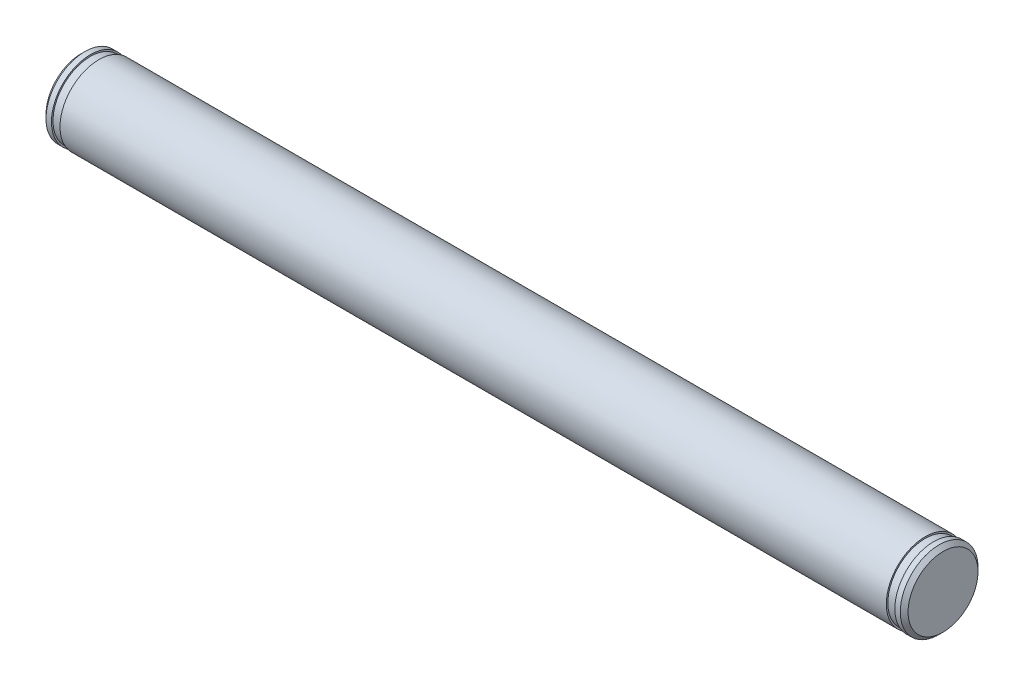
ISO-10303-21;
HEADER;
FILE_DESCRIPTION(('STEP AP214'),'2;1');
FILE_NAME('part.step','',(''),(''),'','','');
FILE_SCHEMA(('AUTOMOTIVE_DESIGN { 1 0 10303 214 1 1 1 1 }'));
ENDSEC;
DATA;
#1=APPLICATION_CONTEXT('core data for automotive mechanical design processes');
#2=APPLICATION_PROTOCOL_DEFINITION('international standard','automotive_design',2000,#1);
#3=PRODUCT_CONTEXT('',#1,'mechanical');
#4=PRODUCT('Part','Part','',(#3));
#5=PRODUCT_RELATED_PRODUCT_CATEGORY('part','',(#4));
#6=PRODUCT_DEFINITION_FORMATION('','',#4);
#7=PRODUCT_DEFINITION_CONTEXT('part definition',#1,'design');
#8=PRODUCT_DEFINITION('design','',#6,#7);
#9=PRODUCT_DEFINITION_SHAPE('','',#8);
#10=(LENGTH_UNIT() NAMED_UNIT(*) SI_UNIT(.MILLI.,.METRE.));
#11=(NAMED_UNIT(*) PLANE_ANGLE_UNIT() SI_UNIT($,.RADIAN.));
#12=(NAMED_UNIT(*) SI_UNIT($,.STERADIAN.) SOLID_ANGLE_UNIT());
#13=UNCERTAINTY_MEASURE_WITH_UNIT(LENGTH_MEASURE(1.E-05),#10,'distance_accuracy_value','');
#14=(GEOMETRIC_REPRESENTATION_CONTEXT(3) GLOBAL_UNCERTAINTY_ASSIGNED_CONTEXT((#13)) GLOBAL_UNIT_ASSIGNED_CONTEXT((#10,
#11,#12)) REPRESENTATION_CONTEXT('',''));
#15=CARTESIAN_POINT('',(0.,0.,0.));
#16=DIRECTION('',(0.,0.,1.));
#17=DIRECTION('',(1.,0.,0.));
#18=AXIS2_PLACEMENT_3D('',#15,#16,#17);
#19=CARTESIAN_POINT('',(-55.45,0.,0.));
#20=DIRECTION('',(-1.,0.,0.));
#21=DIRECTION('',(0.,-1.,0.));
#22=AXIS2_PLACEMENT_3D('',#19,#20,#21);
#23=PLANE('',#22);
#24=CARTESIAN_POINT('',(-55.45,0.,0.));
#25=DIRECTION('',(-1.,0.,0.));
#26=DIRECTION('',(0.,-1.,0.));
#27=AXIS2_PLACEMENT_3D('',#24,#25,#26);
#28=CIRCLE('',#27,4.49999999999996);
#29=CARTESIAN_POINT('',(-55.45,-4.49999999999996,0.));
#30=VERTEX_POINT('',#29);
#31=EDGE_CURVE('E10',#30,#30,#28,.T.);
#32=ORIENTED_EDGE('',*,*,#31,.T.);
#33=EDGE_LOOP('',(#32));
#34=FACE_BOUND('',#33,.T.);
#35=ADVANCED_FACE('F34',(#34),#23,.T.);
#36=CARTESIAN_POINT('',(55.45,0.,0.));
#37=DIRECTION('',(1.,0.,0.));
#38=DIRECTION('',(0.,1.,0.));
#39=AXIS2_PLACEMENT_3D('',#36,#37,#38);
#40=CYLINDRICAL_SURFACE('',#39,4.99999999999999);
#41=CARTESIAN_POINT('',(-54.95,0.,0.));
#42=DIRECTION('',(-1.,0.,0.));
#43=DIRECTION('',(0.,-1.,0.));
#44=AXIS2_PLACEMENT_3D('',#41,#42,#43);
#45=CIRCLE('',#44,4.99999999999999);
#46=CARTESIAN_POINT('',(-54.95,-4.99999999999999,0.));
#47=VERTEX_POINT('',#46);
#48=EDGE_CURVE('E42',#47,#47,#45,.F.);
#49=ORIENTED_EDGE('',*,*,#48,.T.);
#50=EDGE_LOOP('',(#49));
#51=FACE_BOUND('',#50,.T.);
#52=CARTESIAN_POINT('',(-54.25,0.,0.));
#53=DIRECTION('',(1.,0.,0.));
#54=DIRECTION('',(0.,1.,0.));
#55=AXIS2_PLACEMENT_3D('',#52,#53,#54);
#56=CIRCLE('',#55,4.99999999999999);
#57=CARTESIAN_POINT('',(-54.25,4.99999999999999,0.));
#58=VERTEX_POINT('',#57);
#59=EDGE_CURVE('E55',#58,#58,#56,.T.);
#60=ORIENTED_EDGE('',*,*,#59,.F.);
#61=EDGE_LOOP('',(#60));
#62=FACE_BOUND('',#61,.T.);
#63=ADVANCED_FACE('F98',(#51,#62),#40,.T.);
#64=CARTESIAN_POINT('',(-54.25,4.99999999999999,0.));
#65=DIRECTION('',(1.,0.,0.));
#66=DIRECTION('',(0.,1.,0.));
#67=AXIS2_PLACEMENT_3D('',#64,#65,#66);
#68=PLANE('',#67);
#69=ORIENTED_EDGE('',*,*,#59,.T.);
#70=EDGE_LOOP('',(#69));
#71=FACE_BOUND('',#70,.T.);
#72=CARTESIAN_POINT('',(-54.25,0.,0.));
#73=DIRECTION('',(1.,0.,0.));
#74=DIRECTION('',(0.,1.,0.));
#75=AXIS2_PLACEMENT_3D('',#72,#73,#74);
#76=CIRCLE('',#75,4.79999999999998);
#77=CARTESIAN_POINT('',(-54.25,4.79999999999998,0.));
#78=VERTEX_POINT('',#77);
#79=EDGE_CURVE('E58',#78,#78,#76,.T.);
#80=ORIENTED_EDGE('',*,*,#79,.F.);
#81=EDGE_LOOP('',(#80));
#82=FACE_BOUND('',#81,.T.);
#83=ADVANCED_FACE('F103',(#71,#82),#68,.T.);
#84=CARTESIAN_POINT('',(55.45,0.,0.));
#85=DIRECTION('',(1.,0.,0.));
#86=DIRECTION('',(0.,1.,0.));
#87=AXIS2_PLACEMENT_3D('',#84,#85,#86);
#88=CYLINDRICAL_SURFACE('',#87,4.79999999999999);
#89=ORIENTED_EDGE('',*,*,#79,.T.);
#90=EDGE_LOOP('',(#89));
#91=FACE_BOUND('',#90,.T.);
#92=CARTESIAN_POINT('',(-53.15,0.,0.));
#93=DIRECTION('',(1.,0.,0.));
#94=DIRECTION('',(0.,1.,0.));
#95=AXIS2_PLACEMENT_3D('',#92,#93,#94);
#96=CIRCLE('',#95,4.79999999999998);
#97=CARTESIAN_POINT('',(-53.15,4.79999999999998,0.));
#98=VERTEX_POINT('',#97);
#99=EDGE_CURVE('E61',#98,#98,#96,.T.);
#100=ORIENTED_EDGE('',*,*,#99,.F.);
#101=EDGE_LOOP('',(#100));
#102=FACE_BOUND('',#101,.T.);
#103=ADVANCED_FACE('F179',(#91,#102),#88,.T.);
#104=CARTESIAN_POINT('',(-53.15,4.79999999999999,0.));
#105=DIRECTION('',(-1.,0.,0.));
#106=DIRECTION('',(0.,-1.,0.));
#107=AXIS2_PLACEMENT_3D('',#104,#105,#106);
#108=PLANE('',#107);
#109=ORIENTED_EDGE('',*,*,#99,.T.);
#110=EDGE_LOOP('',(#109));
#111=FACE_BOUND('',#110,.T.);
#112=CARTESIAN_POINT('',(-53.15,0.,0.));
#113=DIRECTION('',(1.,0.,0.));
#114=DIRECTION('',(0.,1.,0.));
#115=AXIS2_PLACEMENT_3D('',#112,#113,#114);
#116=CIRCLE('',#115,4.99999999999999);
#117=CARTESIAN_POINT('',(-53.15,4.99999999999999,0.));
#118=VERTEX_POINT('',#117);
#119=EDGE_CURVE('E64',#118,#118,#116,.T.);
#120=ORIENTED_EDGE('',*,*,#119,.F.);
#121=EDGE_LOOP('',(#120));
#122=FACE_BOUND('',#121,.T.);
#123=ADVANCED_FACE('F169',(#111,#122),#108,.T.);
#124=CARTESIAN_POINT('',(55.45,0.,0.));
#125=DIRECTION('',(1.,0.,0.));
#126=DIRECTION('',(0.,1.,0.));
#127=AXIS2_PLACEMENT_3D('',#124,#125,#126);
#128=CYLINDRICAL_SURFACE('',#127,4.99999999999999);
#129=ORIENTED_EDGE('',*,*,#119,.T.);
#130=EDGE_LOOP('',(#129));
#131=FACE_BOUND('',#130,.T.);
#132=CARTESIAN_POINT('',(53.15,0.,0.));
#133=DIRECTION('',(1.,0.,0.));
#134=DIRECTION('',(0.,1.,0.));
#135=AXIS2_PLACEMENT_3D('',#132,#133,#134);
#136=CIRCLE('',#135,4.99999999999999);
#137=CARTESIAN_POINT('',(53.15,5.,0.));
#138=VERTEX_POINT('',#137);
#139=EDGE_CURVE('E67',#138,#138,#136,.T.);
#140=ORIENTED_EDGE('',*,*,#139,.F.);
#141=EDGE_LOOP('',(#140));
#142=FACE_BOUND('',#141,.T.);
#143=ADVANCED_FACE('F159',(#131,#142),#128,.T.);
#144=CARTESIAN_POINT('',(53.15,4.8,0.));
#145=DIRECTION('',(1.,0.,0.));
#146=DIRECTION('',(0.,1.,0.));
#147=AXIS2_PLACEMENT_3D('',#144,#145,#146);
#148=PLANE('',#147);
#149=ORIENTED_EDGE('',*,*,#139,.T.);
#150=EDGE_LOOP('',(#149));
#151=FACE_BOUND('',#150,.T.);
#152=CARTESIAN_POINT('',(53.15,0.,0.));
#153=DIRECTION('',(1.,0.,0.));
#154=DIRECTION('',(0.,1.,0.));
#155=AXIS2_PLACEMENT_3D('',#152,#153,#154);
#156=CIRCLE('',#155,4.79999999999998);
#157=CARTESIAN_POINT('',(53.15,4.8,0.));
#158=VERTEX_POINT('',#157);
#159=EDGE_CURVE('E70',#158,#158,#156,.T.);
#160=ORIENTED_EDGE('',*,*,#159,.F.);
#161=EDGE_LOOP('',(#160));
#162=FACE_BOUND('',#161,.T.);
#163=ADVANCED_FACE('F94',(#151,#162),#148,.T.);
#164=CARTESIAN_POINT('',(55.45,0.,0.));
#165=DIRECTION('',(1.,0.,0.));
#166=DIRECTION('',(0.,1.,0.));
#167=AXIS2_PLACEMENT_3D('',#164,#165,#166);
#168=CYLINDRICAL_SURFACE('',#167,4.79999999999999);
#169=ORIENTED_EDGE('',*,*,#159,.T.);
#170=EDGE_LOOP('',(#169));
#171=FACE_BOUND('',#170,.T.);
#172=CARTESIAN_POINT('',(54.25,0.,0.));
#173=DIRECTION('',(1.,0.,0.));
#174=DIRECTION('',(0.,1.,0.));
#175=AXIS2_PLACEMENT_3D('',#172,#173,#174);
#176=CIRCLE('',#175,4.79999999999998);
#177=CARTESIAN_POINT('',(54.25,4.8,0.));
#178=VERTEX_POINT('',#177);
#179=EDGE_CURVE('E73',#178,#178,#176,.T.);
#180=ORIENTED_EDGE('',*,*,#179,.F.);
#181=EDGE_LOOP('',(#180));
#182=FACE_BOUND('',#181,.T.);
#183=ADVANCED_FACE('F84',(#171,#182),#168,.T.);
#184=CARTESIAN_POINT('',(54.25,5.,0.));
#185=DIRECTION('',(-1.,0.,0.));
#186=DIRECTION('',(0.,-1.,0.));
#187=AXIS2_PLACEMENT_3D('',#184,#185,#186);
#188=PLANE('',#187);
#189=ORIENTED_EDGE('',*,*,#179,.T.);
#190=EDGE_LOOP('',(#189));
#191=FACE_BOUND('',#190,.T.);
#192=CARTESIAN_POINT('',(54.25,0.,0.));
#193=DIRECTION('',(1.,0.,0.));
#194=DIRECTION('',(0.,1.,0.));
#195=AXIS2_PLACEMENT_3D('',#192,#193,#194);
#196=CIRCLE('',#195,4.99999999999999);
#197=CARTESIAN_POINT('',(54.25,5.,0.));
#198=VERTEX_POINT('',#197);
#199=EDGE_CURVE('E76',#198,#198,#196,.T.);
#200=ORIENTED_EDGE('',*,*,#199,.F.);
#201=EDGE_LOOP('',(#200));
#202=FACE_BOUND('',#201,.T.);
#203=ADVANCED_FACE('F82',(#191,#202),#188,.T.);
#204=CARTESIAN_POINT('',(55.45,0.,0.));
#205=DIRECTION('',(1.,0.,0.));
#206=DIRECTION('',(0.,1.,0.));
#207=AXIS2_PLACEMENT_3D('',#204,#205,#206);
#208=CYLINDRICAL_SURFACE('',#207,4.99999999999999);
#209=CARTESIAN_POINT('',(54.95,0.,0.));
#210=DIRECTION('',(1.,0.,0.));
#211=DIRECTION('',(0.,1.,0.));
#212=AXIS2_PLACEMENT_3D('',#209,#210,#211);
#213=CIRCLE('',#212,4.99999999999999);
#214=CARTESIAN_POINT('',(54.95,5.,0.));
#215=VERTEX_POINT('',#214);
#216=EDGE_CURVE('E46',#215,#215,#213,.F.);
#217=ORIENTED_EDGE('',*,*,#216,.T.);
#218=EDGE_LOOP('',(#217));
#219=FACE_BOUND('',#218,.T.);
#220=ORIENTED_EDGE('',*,*,#199,.T.);
#221=EDGE_LOOP('',(#220));
#222=FACE_BOUND('',#221,.T.);
#223=ADVANCED_FACE('F80',(#219,#222),#208,.T.);
#224=CARTESIAN_POINT('',(55.45,0.,0.));
#225=DIRECTION('',(1.,0.,0.));
#226=DIRECTION('',(0.,1.,0.));
#227=AXIS2_PLACEMENT_3D('',#224,#225,#226);
#228=PLANE('',#227);
#229=CARTESIAN_POINT('',(55.45,0.,0.));
#230=DIRECTION('',(1.,0.,0.));
#231=DIRECTION('',(0.,1.,0.));
#232=AXIS2_PLACEMENT_3D('',#229,#230,#231);
#233=CIRCLE('',#232,4.49999999999999);
#234=CARTESIAN_POINT('',(55.45,4.5,0.));
#235=VERTEX_POINT('',#234);
#236=EDGE_CURVE('E50',#235,#235,#233,.T.);
#237=ORIENTED_EDGE('',*,*,#236,.T.);
#238=EDGE_LOOP('',(#237));
#239=FACE_BOUND('',#238,.T.);
#240=ADVANCED_FACE('F91',(#239),#228,.T.);
#241=CARTESIAN_POINT('',(55.45,0.,0.));
#242=DIRECTION('',(-1.,0.,0.));
#243=DIRECTION('',(0.,-1.,0.));
#244=AXIS2_PLACEMENT_3D('',#241,#242,#243);
#245=CONICAL_SURFACE('',#244,4.49999999999999,0.785398163397444);
#246=ORIENTED_EDGE('',*,*,#216,.F.);
#247=EDGE_LOOP('',(#246));
#248=FACE_BOUND('',#247,.T.);
#249=ORIENTED_EDGE('',*,*,#236,.F.);
#250=EDGE_LOOP('',(#249));
#251=FACE_BOUND('',#250,.T.);
#252=ADVANCED_FACE('F107',(#248,#251),#245,.T.);
#253=CARTESIAN_POINT('',(-54.95,0.,0.));
#254=DIRECTION('',(1.,0.,0.));
#255=DIRECTION('',(0.,1.,0.));
#256=AXIS2_PLACEMENT_3D('',#253,#254,#255);
#257=CONICAL_SURFACE('',#256,4.99999999999999,0.785398163397458);
#258=ORIENTED_EDGE('',*,*,#31,.F.);
#259=EDGE_LOOP('',(#258));
#260=FACE_BOUND('',#259,.T.);
#261=ORIENTED_EDGE('',*,*,#48,.F.);
#262=EDGE_LOOP('',(#261));
#263=FACE_BOUND('',#262,.T.);
#264=ADVANCED_FACE('F37',(#260,#263),#257,.T.);
#265=CLOSED_SHELL('',(#35,#63,#83,#103,#123,#143,#163,#183,#203,#223,#240,#252,#264));
#266=MANIFOLD_SOLID_BREP('B2',#265);
#267=ADVANCED_BREP_SHAPE_REPRESENTATION('',(#18,#266),#14);
#268=SHAPE_DEFINITION_REPRESENTATION(#9,#267);
ENDSEC;
END-ISO-10303-21;
